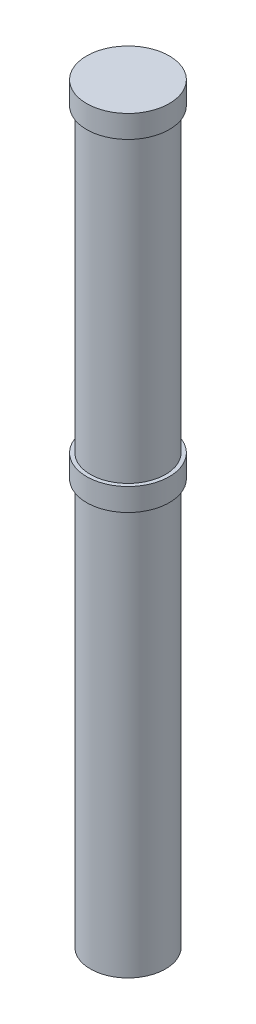
ISO-10303-21;
HEADER;
FILE_DESCRIPTION(('STEP AP214'),'2;1');
FILE_NAME('part.step','',(''),(''),'','','');
FILE_SCHEMA(('AUTOMOTIVE_DESIGN { 1 0 10303 214 1 1 1 1 }'));
ENDSEC;
DATA;
#1=APPLICATION_CONTEXT('core data for automotive mechanical design processes');
#2=APPLICATION_PROTOCOL_DEFINITION('international standard','automotive_design',2000,#1);
#3=PRODUCT_CONTEXT('',#1,'mechanical');
#4=PRODUCT('Part','Part','',(#3));
#5=PRODUCT_RELATED_PRODUCT_CATEGORY('part','',(#4));
#6=PRODUCT_DEFINITION_FORMATION('','',#4);
#7=PRODUCT_DEFINITION_CONTEXT('part definition',#1,'design');
#8=PRODUCT_DEFINITION('design','',#6,#7);
#9=PRODUCT_DEFINITION_SHAPE('','',#8);
#10=(LENGTH_UNIT() NAMED_UNIT(*) SI_UNIT(.MILLI.,.METRE.));
#11=(NAMED_UNIT(*) PLANE_ANGLE_UNIT() SI_UNIT($,.RADIAN.));
#12=(NAMED_UNIT(*) SI_UNIT($,.STERADIAN.) SOLID_ANGLE_UNIT());
#13=UNCERTAINTY_MEASURE_WITH_UNIT(LENGTH_MEASURE(1.E-05),#10,'distance_accuracy_value','');
#14=(GEOMETRIC_REPRESENTATION_CONTEXT(3) GLOBAL_UNCERTAINTY_ASSIGNED_CONTEXT((#13)) GLOBAL_UNIT_ASSIGNED_CONTEXT((#10,
#11,#12)) REPRESENTATION_CONTEXT('',''));
#15=CARTESIAN_POINT('',(0.,0.,0.));
#16=DIRECTION('',(0.,0.,1.));
#17=DIRECTION('',(1.,0.,0.));
#18=AXIS2_PLACEMENT_3D('',#15,#16,#17);
#19=CARTESIAN_POINT('',(0.,-68.1993243243243,0.));
#20=DIRECTION('',(0.,-1.,0.));
#21=DIRECTION('',(1.,0.,0.));
#22=AXIS2_PLACEMENT_3D('',#19,#20,#21);
#23=PLANE('',#22);
#24=CARTESIAN_POINT('',(0.,-68.1993243243243,0.));
#25=DIRECTION('',(0.,1.,0.));
#26=DIRECTION('',(-1.,0.,0.));
#27=AXIS2_PLACEMENT_3D('',#24,#25,#26);
#28=CIRCLE('',#27,4.);
#29=CARTESIAN_POINT('',(-3.99999999999999,-68.1993243243243,0.));
#30=VERTEX_POINT('',#29);
#31=EDGE_CURVE('E10',#30,#30,#28,.T.);
#32=ORIENTED_EDGE('',*,*,#31,.F.);
#33=EDGE_LOOP('',(#32));
#34=FACE_BOUND('',#33,.T.);
#35=ADVANCED_FACE('F37',(#34),#23,.T.);
#36=CARTESIAN_POINT('',(0.,6.80067567567568,0.));
#37=DIRECTION('',(0.,1.,0.));
#38=DIRECTION('',(-1.,0.,0.));
#39=AXIS2_PLACEMENT_3D('',#36,#37,#38);
#40=CYLINDRICAL_SURFACE('',#39,4.);
#41=ORIENTED_EDGE('',*,*,#31,.T.);
#42=EDGE_LOOP('',(#41));
#43=FACE_BOUND('',#42,.T.);
#44=CARTESIAN_POINT('',(0.,-93.1993243243243,0.));
#45=DIRECTION('',(0.,1.,0.));
#46=DIRECTION('',(-1.,0.,0.));
#47=AXIS2_PLACEMENT_3D('',#44,#45,#46);
#48=CIRCLE('',#47,4.);
#49=CARTESIAN_POINT('',(-3.99999999999999,-93.1993243243243,0.));
#50=VERTEX_POINT('',#49);
#51=EDGE_CURVE('E44',#50,#50,#48,.T.);
#52=ORIENTED_EDGE('',*,*,#51,.F.);
#53=EDGE_LOOP('',(#52));
#54=FACE_BOUND('',#53,.T.);
#55=ADVANCED_FACE('F101',(#43,#54),#40,.F.);
#56=CARTESIAN_POINT('',(-3.99999999999999,-93.1993243243243,0.));
#57=DIRECTION('',(0.,-1.,0.));
#58=DIRECTION('',(1.,0.,0.));
#59=AXIS2_PLACEMENT_3D('',#56,#57,#58);
#60=PLANE('',#59);
#61=ORIENTED_EDGE('',*,*,#51,.T.);
#62=EDGE_LOOP('',(#61));
#63=FACE_BOUND('',#62,.T.);
#64=CARTESIAN_POINT('',(0.,-93.1993243243243,0.));
#65=DIRECTION('',(0.,1.,0.));
#66=DIRECTION('',(-1.,0.,0.));
#67=AXIS2_PLACEMENT_3D('',#64,#65,#66);
#68=CIRCLE('',#67,5.);
#69=CARTESIAN_POINT('',(-4.99999999999999,-93.1993243243243,0.));
#70=VERTEX_POINT('',#69);
#71=EDGE_CURVE('E49',#70,#70,#68,.T.);
#72=ORIENTED_EDGE('',*,*,#71,.F.);
#73=EDGE_LOOP('',(#72));
#74=FACE_BOUND('',#73,.T.);
#75=ADVANCED_FACE('F106',(#63,#74),#60,.T.);
#76=CARTESIAN_POINT('',(0.,6.80067567567568,0.));
#77=DIRECTION('',(0.,1.,0.));
#78=DIRECTION('',(-1.,0.,0.));
#79=AXIS2_PLACEMENT_3D('',#76,#77,#78);
#80=CYLINDRICAL_SURFACE('',#79,5.);
#81=ORIENTED_EDGE('',*,*,#71,.T.);
#82=EDGE_LOOP('',(#81));
#83=FACE_BOUND('',#82,.T.);
#84=CARTESIAN_POINT('',(0.,-39.1993243243243,0.));
#85=DIRECTION('',(0.,1.,0.));
#86=DIRECTION('',(-1.,0.,0.));
#87=AXIS2_PLACEMENT_3D('',#84,#85,#86);
#88=CIRCLE('',#87,4.99999999999999);
#89=CARTESIAN_POINT('',(-4.99999999999999,-39.1993243243243,0.));
#90=VERTEX_POINT('',#89);
#91=EDGE_CURVE('E54',#90,#90,#88,.T.);
#92=ORIENTED_EDGE('',*,*,#91,.F.);
#93=EDGE_LOOP('',(#92));
#94=FACE_BOUND('',#93,.T.);
#95=ADVANCED_FACE('F110',(#83,#94),#80,.T.);
#96=CARTESIAN_POINT('',(-4.99999999999999,-39.1993243243243,0.));
#97=DIRECTION('',(0.,-1.,0.));
#98=DIRECTION('',(1.,0.,0.));
#99=AXIS2_PLACEMENT_3D('',#96,#97,#98);
#100=PLANE('',#99);
#101=ORIENTED_EDGE('',*,*,#91,.T.);
#102=EDGE_LOOP('',(#101));
#103=FACE_BOUND('',#102,.T.);
#104=CARTESIAN_POINT('',(0.,-39.1993243243243,0.));
#105=DIRECTION('',(0.,1.,0.));
#106=DIRECTION('',(-1.,0.,0.));
#107=AXIS2_PLACEMENT_3D('',#104,#105,#106);
#108=CIRCLE('',#107,5.50000000000001);
#109=CARTESIAN_POINT('',(-5.5,-39.1993243243243,0.));
#110=VERTEX_POINT('',#109);
#111=EDGE_CURVE('E60',#110,#110,#108,.T.);
#112=ORIENTED_EDGE('',*,*,#111,.F.);
#113=EDGE_LOOP('',(#112));
#114=FACE_BOUND('',#113,.T.);
#115=ADVANCED_FACE('F116',(#103,#114),#100,.T.);
#116=CARTESIAN_POINT('',(0.,6.80067567567568,0.));
#117=DIRECTION('',(0.,1.,0.));
#118=DIRECTION('',(-1.,0.,0.));
#119=AXIS2_PLACEMENT_3D('',#116,#117,#118);
#120=CYLINDRICAL_SURFACE('',#119,5.50000000000001);
#121=ORIENTED_EDGE('',*,*,#111,.T.);
#122=EDGE_LOOP('',(#121));
#123=FACE_BOUND('',#122,.T.);
#124=CARTESIAN_POINT('',(0.,-36.1993243243243,0.));
#125=DIRECTION('',(0.,1.,0.));
#126=DIRECTION('',(-1.,0.,0.));
#127=AXIS2_PLACEMENT_3D('',#124,#125,#126);
#128=CIRCLE('',#127,5.50000000000001);
#129=CARTESIAN_POINT('',(-5.5,-36.1993243243243,0.));
#130=VERTEX_POINT('',#129);
#131=EDGE_CURVE('E64',#130,#130,#128,.T.);
#132=ORIENTED_EDGE('',*,*,#131,.F.);
#133=EDGE_LOOP('',(#132));
#134=FACE_BOUND('',#133,.T.);
#135=ADVANCED_FACE('F120',(#123,#134),#120,.T.);
#136=CARTESIAN_POINT('',(-5.5,-36.1993243243243,0.));
#137=DIRECTION('',(0.,1.,0.));
#138=DIRECTION('',(-1.,0.,0.));
#139=AXIS2_PLACEMENT_3D('',#136,#137,#138);
#140=PLANE('',#139);
#141=ORIENTED_EDGE('',*,*,#131,.T.);
#142=EDGE_LOOP('',(#141));
#143=FACE_BOUND('',#142,.T.);
#144=CARTESIAN_POINT('',(0.,-36.1993243243243,0.));
#145=DIRECTION('',(0.,1.,0.));
#146=DIRECTION('',(-1.,0.,0.));
#147=AXIS2_PLACEMENT_3D('',#144,#145,#146);
#148=CIRCLE('',#147,4.99999999999999);
#149=CARTESIAN_POINT('',(-4.99999999999999,-36.1993243243243,0.));
#150=VERTEX_POINT('',#149);
#151=EDGE_CURVE('E68',#150,#150,#148,.T.);
#152=ORIENTED_EDGE('',*,*,#151,.F.);
#153=EDGE_LOOP('',(#152));
#154=FACE_BOUND('',#153,.T.);
#155=ADVANCED_FACE('F124',(#143,#154),#140,.T.);
#156=CARTESIAN_POINT('',(0.,6.80067567567568,0.));
#157=DIRECTION('',(0.,1.,0.));
#158=DIRECTION('',(-1.,0.,0.));
#159=AXIS2_PLACEMENT_3D('',#156,#157,#158);
#160=CYLINDRICAL_SURFACE('',#159,5.);
#161=ORIENTED_EDGE('',*,*,#151,.T.);
#162=EDGE_LOOP('',(#161));
#163=FACE_BOUND('',#162,.T.);
#164=CARTESIAN_POINT('',(0.,3.80067567567568,0.));
#165=DIRECTION('',(0.,1.,0.));
#166=DIRECTION('',(-1.,0.,0.));
#167=AXIS2_PLACEMENT_3D('',#164,#165,#166);
#168=CIRCLE('',#167,5.);
#169=CARTESIAN_POINT('',(-5.,3.80067567567568,0.));
#170=VERTEX_POINT('',#169);
#171=EDGE_CURVE('E72',#170,#170,#168,.T.);
#172=ORIENTED_EDGE('',*,*,#171,.F.);
#173=EDGE_LOOP('',(#172));
#174=FACE_BOUND('',#173,.T.);
#175=ADVANCED_FACE('F97',(#163,#174),#160,.T.);
#176=CARTESIAN_POINT('',(-5.,3.80067567567568,0.));
#177=DIRECTION('',(0.,-1.,0.));
#178=DIRECTION('',(1.,0.,0.));
#179=AXIS2_PLACEMENT_3D('',#176,#177,#178);
#180=PLANE('',#179);
#181=ORIENTED_EDGE('',*,*,#171,.T.);
#182=EDGE_LOOP('',(#181));
#183=FACE_BOUND('',#182,.T.);
#184=CARTESIAN_POINT('',(0.,3.80067567567568,0.));
#185=DIRECTION('',(0.,1.,0.));
#186=DIRECTION('',(-1.,0.,0.));
#187=AXIS2_PLACEMENT_3D('',#184,#185,#186);
#188=CIRCLE('',#187,5.5);
#189=CARTESIAN_POINT('',(-5.5,3.80067567567568,0.));
#190=VERTEX_POINT('',#189);
#191=EDGE_CURVE('E76',#190,#190,#188,.T.);
#192=ORIENTED_EDGE('',*,*,#191,.F.);
#193=EDGE_LOOP('',(#192));
#194=FACE_BOUND('',#193,.T.);
#195=ADVANCED_FACE('F89',(#183,#194),#180,.T.);
#196=CARTESIAN_POINT('',(0.,6.80067567567568,0.));
#197=DIRECTION('',(0.,1.,0.));
#198=DIRECTION('',(-1.,0.,0.));
#199=AXIS2_PLACEMENT_3D('',#196,#197,#198);
#200=CYLINDRICAL_SURFACE('',#199,5.5);
#201=ORIENTED_EDGE('',*,*,#191,.T.);
#202=EDGE_LOOP('',(#201));
#203=FACE_BOUND('',#202,.T.);
#204=CARTESIAN_POINT('',(0.,6.80067567567568,0.));
#205=DIRECTION('',(0.,1.,0.));
#206=DIRECTION('',(-1.,0.,0.));
#207=AXIS2_PLACEMENT_3D('',#204,#205,#206);
#208=CIRCLE('',#207,5.5);
#209=CARTESIAN_POINT('',(-5.5,6.80067567567568,0.));
#210=VERTEX_POINT('',#209);
#211=EDGE_CURVE('E80',#210,#210,#208,.T.);
#212=ORIENTED_EDGE('',*,*,#211,.F.);
#213=EDGE_LOOP('',(#212));
#214=FACE_BOUND('',#213,.T.);
#215=ADVANCED_FACE('F87',(#203,#214),#200,.T.);
#216=CARTESIAN_POINT('',(-5.5,6.80067567567568,0.));
#217=DIRECTION('',(0.,1.,0.));
#218=DIRECTION('',(-1.,0.,0.));
#219=AXIS2_PLACEMENT_3D('',#216,#217,#218);
#220=PLANE('',#219);
#221=ORIENTED_EDGE('',*,*,#211,.T.);
#222=EDGE_LOOP('',(#221));
#223=FACE_BOUND('',#222,.T.);
#224=ADVANCED_FACE('F85',(#223),#220,.T.);
#225=CLOSED_SHELL('',(#35,#55,#75,#95,#115,#135,#155,#175,#195,#215,#224));
#226=MANIFOLD_SOLID_BREP('B2',#225);
#227=ADVANCED_BREP_SHAPE_REPRESENTATION('',(#18,#226),#14);
#228=SHAPE_DEFINITION_REPRESENTATION(#9,#227);
ENDSEC;
END-ISO-10303-21;
